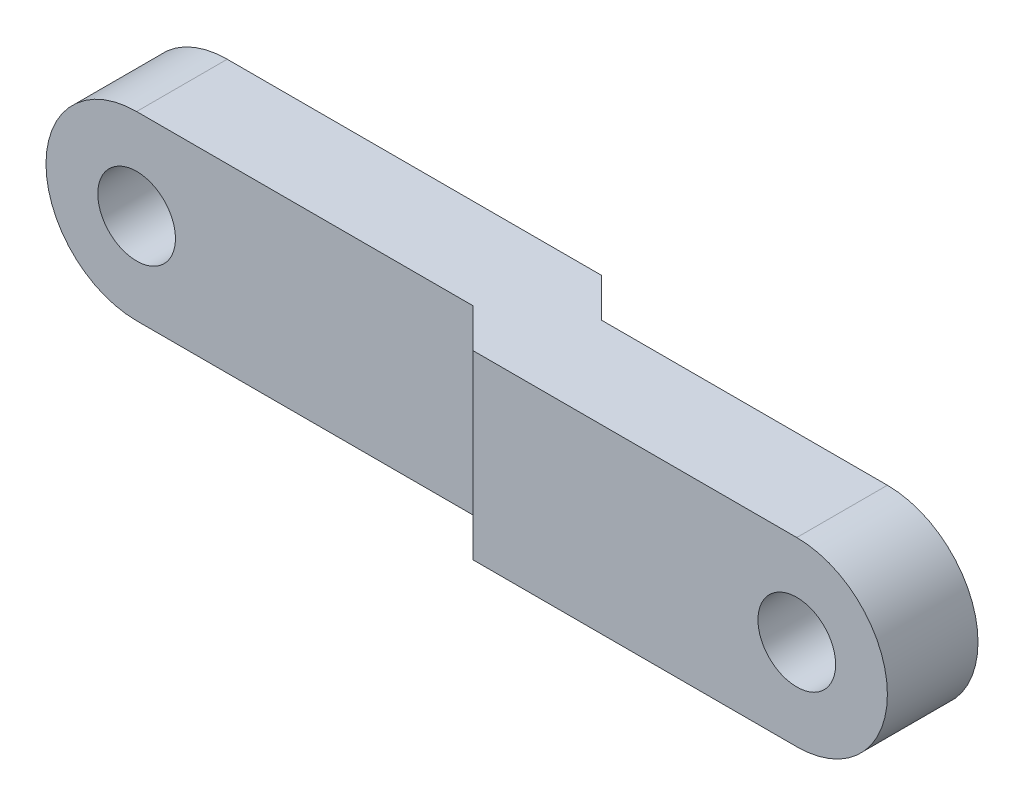
ISO-10303-21;
HEADER;
FILE_DESCRIPTION(('STEP AP214'),'2;1');
FILE_NAME('part.step','',(''),(''),'','','');
FILE_SCHEMA(('AUTOMOTIVE_DESIGN { 1 0 10303 214 1 1 1 1 }'));
ENDSEC;
DATA;
#1=APPLICATION_CONTEXT('core data for automotive mechanical design processes');
#2=APPLICATION_PROTOCOL_DEFINITION('international standard','automotive_design',2000,#1);
#3=PRODUCT_CONTEXT('',#1,'mechanical');
#4=PRODUCT('Part','Part','',(#3));
#5=PRODUCT_RELATED_PRODUCT_CATEGORY('part','',(#4));
#6=PRODUCT_DEFINITION_FORMATION('','',#4);
#7=PRODUCT_DEFINITION_CONTEXT('part definition',#1,'design');
#8=PRODUCT_DEFINITION('design','',#6,#7);
#9=PRODUCT_DEFINITION_SHAPE('','',#8);
#10=(LENGTH_UNIT() NAMED_UNIT(*) SI_UNIT(.MILLI.,.METRE.));
#11=(NAMED_UNIT(*) PLANE_ANGLE_UNIT() SI_UNIT($,.RADIAN.));
#12=(NAMED_UNIT(*) SI_UNIT($,.STERADIAN.) SOLID_ANGLE_UNIT());
#13=UNCERTAINTY_MEASURE_WITH_UNIT(LENGTH_MEASURE(1.E-05),#10,'distance_accuracy_value','');
#14=(GEOMETRIC_REPRESENTATION_CONTEXT(3) GLOBAL_UNCERTAINTY_ASSIGNED_CONTEXT((#13)) GLOBAL_UNIT_ASSIGNED_CONTEXT((#10,
#11,#12)) REPRESENTATION_CONTEXT('',''));
#15=CARTESIAN_POINT('',(0.,0.,0.));
#16=DIRECTION('',(0.,0.,1.));
#17=DIRECTION('',(1.,0.,0.));
#18=AXIS2_PLACEMENT_3D('',#15,#16,#17);
#19=CARTESIAN_POINT('',(0.,-3.5,5.));
#20=DIRECTION('',(0.,0.,-1.));
#21=DIRECTION('',(-1.,0.,0.));
#22=AXIS2_PLACEMENT_3D('',#19,#20,#21);
#23=PLANE('',#22);
#24=DIRECTION('',(-1.,0.,0.));
#25=VECTOR('',#24,1.);
#26=CARTESIAN_POINT('',(0.,0.,5.));
#27=LINE('',#26,#25);
#28=CARTESIAN_POINT('',(27.,0.,5.));
#29=VERTEX_POINT('',#28);
#30=CARTESIAN_POINT('',(14.5,0.,5.));
#31=VERTEX_POINT('',#30);
#32=EDGE_CURVE('E178',#29,#31,#27,.T.);
#33=ORIENTED_EDGE('',*,*,#32,.T.);
#34=DIRECTION('',(0.,1.,0.));
#35=VECTOR('',#34,1.);
#36=CARTESIAN_POINT('',(14.5,-7.,5.));
#37=LINE('',#36,#35);
#38=CARTESIAN_POINT('',(14.5,-7.,5.));
#39=VERTEX_POINT('',#38);
#40=EDGE_CURVE('E113',#39,#31,#37,.T.);
#41=ORIENTED_EDGE('',*,*,#40,.F.);
#42=DIRECTION('',(1.,0.,0.));
#43=VECTOR('',#42,1.);
#44=CARTESIAN_POINT('',(0.,-7.,5.));
#45=LINE('',#44,#43);
#46=CARTESIAN_POINT('',(27.,-7.,5.));
#47=VERTEX_POINT('',#46);
#48=EDGE_CURVE('E126',#39,#47,#45,.T.);
#49=ORIENTED_EDGE('',*,*,#48,.T.);
#50=CARTESIAN_POINT('',(27.,-3.5,5.));
#51=DIRECTION('',(0.,0.,1.));
#52=DIRECTION('',(-1.,0.,0.));
#53=AXIS2_PLACEMENT_3D('',#50,#51,#52);
#54=CIRCLE('',#53,3.5);
#55=EDGE_CURVE('E174',#47,#29,#54,.T.);
#56=ORIENTED_EDGE('',*,*,#55,.T.);
#57=EDGE_LOOP('',(#33,#41,#49,#56));
#58=FACE_BOUND('',#57,.T.);
#59=CARTESIAN_POINT('',(27.,-3.5,5.));
#60=DIRECTION('',(0.,0.,1.));
#61=DIRECTION('',(1.,0.,0.));
#62=AXIS2_PLACEMENT_3D('',#59,#60,#61);
#63=CIRCLE('',#62,1.5);
#64=CARTESIAN_POINT('',(28.5,-3.5,5.));
#65=VERTEX_POINT('',#64);
#66=EDGE_CURVE('E163',#65,#65,#63,.T.);
#67=ORIENTED_EDGE('',*,*,#66,.F.);
#68=EDGE_LOOP('',(#67));
#69=FACE_BOUND('',#68,.T.);
#70=ADVANCED_FACE('F39',(#58,#69),#23,.F.);
#71=CARTESIAN_POINT('',(0.,-3.5,0.));
#72=DIRECTION('',(0.,0.,-1.));
#73=DIRECTION('',(-1.,0.,0.));
#74=AXIS2_PLACEMENT_3D('',#71,#72,#73);
#75=PLANE('',#74);
#76=DIRECTION('',(0.,1.,0.));
#77=VECTOR('',#76,1.);
#78=CARTESIAN_POINT('',(14.4497474683058,-7.,0.));
#79=LINE('',#78,#77);
#80=CARTESIAN_POINT('',(14.4497474683058,-7.,0.));
#81=VERTEX_POINT('',#80);
#82=CARTESIAN_POINT('',(14.4497474683058,0.,0.));
#83=VERTEX_POINT('',#82);
#84=EDGE_CURVE('E134',#81,#83,#79,.T.);
#85=ORIENTED_EDGE('',*,*,#84,.F.);
#86=DIRECTION('',(1.,0.,0.));
#87=VECTOR('',#86,1.);
#88=CARTESIAN_POINT('',(0.,-7.,0.));
#89=LINE('',#88,#87);
#90=CARTESIAN_POINT('',(0.,-7.,0.));
#91=VERTEX_POINT('',#90);
#92=EDGE_CURVE('E186',#91,#81,#89,.T.);
#93=ORIENTED_EDGE('',*,*,#92,.F.);
#94=CARTESIAN_POINT('',(0.,-3.5,0.));
#95=DIRECTION('',(0.,0.,1.));
#96=DIRECTION('',(-1.,0.,0.));
#97=AXIS2_PLACEMENT_3D('',#94,#95,#96);
#98=CIRCLE('',#97,3.5);
#99=CARTESIAN_POINT('',(0.,0.,0.));
#100=VERTEX_POINT('',#99);
#101=EDGE_CURVE('E171',#100,#91,#98,.T.);
#102=ORIENTED_EDGE('',*,*,#101,.F.);
#103=DIRECTION('',(-1.,0.,0.));
#104=VECTOR('',#103,1.);
#105=CARTESIAN_POINT('',(0.,0.,0.));
#106=LINE('',#105,#104);
#107=EDGE_CURVE('E175',#83,#100,#106,.T.);
#108=ORIENTED_EDGE('',*,*,#107,.F.);
#109=EDGE_LOOP('',(#85,#93,#102,#108));
#110=FACE_BOUND('',#109,.T.);
#111=CARTESIAN_POINT('',(0.,-3.5,0.));
#112=DIRECTION('',(0.,0.,1.));
#113=DIRECTION('',(1.,0.,0.));
#114=AXIS2_PLACEMENT_3D('',#111,#112,#113);
#115=CIRCLE('',#114,1.5);
#116=CARTESIAN_POINT('',(1.5,-3.5,0.));
#117=VERTEX_POINT('',#116);
#118=EDGE_CURVE('E167',#117,#117,#115,.T.);
#119=ORIENTED_EDGE('',*,*,#118,.T.);
#120=EDGE_LOOP('',(#119));
#121=FACE_BOUND('',#120,.T.);
#122=ADVANCED_FACE('F216',(#110,#121),#75,.T.);
#123=CARTESIAN_POINT('',(0.,-3.5,5.));
#124=DIRECTION('',(0.,0.,-1.));
#125=DIRECTION('',(-1.,0.,0.));
#126=AXIS2_PLACEMENT_3D('',#123,#124,#125);
#127=CYLINDRICAL_SURFACE('',#126,3.5);
#128=CARTESIAN_POINT('',(0.,-3.5,3.5));
#129=DIRECTION('',(0.,0.,-1.));
#130=DIRECTION('',(-1.,0.,0.));
#131=AXIS2_PLACEMENT_3D('',#128,#129,#130);
#132=CIRCLE('',#131,3.5);
#133=CARTESIAN_POINT('',(0.,-7.,3.5));
#134=VERTEX_POINT('',#133);
#135=CARTESIAN_POINT('',(0.,0.,3.5));
#136=VERTEX_POINT('',#135);
#137=EDGE_CURVE('E118',#134,#136,#132,.T.);
#138=ORIENTED_EDGE('',*,*,#137,.T.);
#139=DIRECTION('',(0.,0.,-1.));
#140=VECTOR('',#139,1.);
#141=CARTESIAN_POINT('',(0.,0.,5.));
#142=LINE('',#141,#140);
#143=EDGE_CURVE('E182',#136,#100,#142,.T.);
#144=ORIENTED_EDGE('',*,*,#143,.T.);
#145=ORIENTED_EDGE('',*,*,#101,.T.);
#146=DIRECTION('',(0.,0.,-1.));
#147=VECTOR('',#146,1.);
#148=CARTESIAN_POINT('',(0.,-7.,5.));
#149=LINE('',#148,#147);
#150=EDGE_CURVE('E11',#134,#91,#149,.T.);
#151=ORIENTED_EDGE('',*,*,#150,.F.);
#152=EDGE_LOOP('',(#138,#144,#145,#151));
#153=FACE_BOUND('',#152,.T.);
#154=ADVANCED_FACE('F41',(#153),#127,.T.);
#155=CARTESIAN_POINT('',(0.,-7.,5.));
#156=DIRECTION('',(0.,1.,0.));
#157=DIRECTION('',(0.,0.,1.));
#158=AXIS2_PLACEMENT_3D('',#155,#156,#157);
#159=PLANE('',#158);
#160=ORIENTED_EDGE('',*,*,#48,.F.);
#161=DIRECTION('',(-0.707106781186546,0.,-0.707106781186549));
#162=VECTOR('',#161,1.);
#163=CARTESIAN_POINT('',(4.75000000000002,-7.,-4.75000000000001));
#164=LINE('',#163,#162);
#165=CARTESIAN_POINT('',(13.,-7.,3.5));
#166=VERTEX_POINT('',#165);
#167=EDGE_CURVE('E107',#39,#166,#164,.T.);
#168=ORIENTED_EDGE('',*,*,#167,.T.);
#169=DIRECTION('',(-1.,0.,0.));
#170=VECTOR('',#169,1.);
#171=CARTESIAN_POINT('',(0.,-7.,3.5));
#172=LINE('',#171,#170);
#173=EDGE_CURVE('E114',#166,#134,#172,.T.);
#174=ORIENTED_EDGE('',*,*,#173,.T.);
#175=ORIENTED_EDGE('',*,*,#150,.T.);
#176=ORIENTED_EDGE('',*,*,#92,.T.);
#177=DIRECTION('',(0.707106781186546,0.,0.707106781186549));
#178=VECTOR('',#177,1.);
#179=CARTESIAN_POINT('',(7.22487373415296,-7.,-7.22487373415292));
#180=LINE('',#179,#178);
#181=CARTESIAN_POINT('',(15.9497474683058,-7.,1.5));
#182=VERTEX_POINT('',#181);
#183=EDGE_CURVE('E139',#81,#182,#180,.T.);
#184=ORIENTED_EDGE('',*,*,#183,.T.);
#185=DIRECTION('',(1.,0.,0.));
#186=VECTOR('',#185,1.);
#187=CARTESIAN_POINT('',(0.,-7.,1.5));
#188=LINE('',#187,#186);
#189=CARTESIAN_POINT('',(27.,-7.,1.5));
#190=VERTEX_POINT('',#189);
#191=EDGE_CURVE('E143',#182,#190,#188,.T.);
#192=ORIENTED_EDGE('',*,*,#191,.T.);
#193=DIRECTION('',(0.,0.,-1.));
#194=VECTOR('',#193,1.);
#195=CARTESIAN_POINT('',(27.,-7.,5.));
#196=LINE('',#195,#194);
#197=EDGE_CURVE('E49',#47,#190,#196,.T.);
#198=ORIENTED_EDGE('',*,*,#197,.F.);
#199=EDGE_LOOP('',(#160,#168,#174,#175,#176,#184,#192,#198));
#200=FACE_BOUND('',#199,.T.);
#201=ADVANCED_FACE('F124',(#200),#159,.F.);
#202=CARTESIAN_POINT('',(27.,-3.5,5.));
#203=DIRECTION('',(0.,0.,-1.));
#204=DIRECTION('',(-1.,0.,0.));
#205=AXIS2_PLACEMENT_3D('',#202,#203,#204);
#206=CYLINDRICAL_SURFACE('',#205,3.5);
#207=CARTESIAN_POINT('',(27.,-3.5,1.5));
#208=DIRECTION('',(0.,0.,1.));
#209=DIRECTION('',(1.,0.,0.));
#210=AXIS2_PLACEMENT_3D('',#207,#208,#209);
#211=CIRCLE('',#210,3.5);
#212=CARTESIAN_POINT('',(27.,0.,1.5));
#213=VERTEX_POINT('',#212);
#214=EDGE_CURVE('E158',#190,#213,#211,.T.);
#215=ORIENTED_EDGE('',*,*,#214,.T.);
#216=DIRECTION('',(0.,0.,-1.));
#217=VECTOR('',#216,1.);
#218=CARTESIAN_POINT('',(27.,0.,5.));
#219=LINE('',#218,#217);
#220=EDGE_CURVE('E195',#29,#213,#219,.T.);
#221=ORIENTED_EDGE('',*,*,#220,.F.);
#222=ORIENTED_EDGE('',*,*,#55,.F.);
#223=ORIENTED_EDGE('',*,*,#197,.T.);
#224=EDGE_LOOP('',(#215,#221,#222,#223));
#225=FACE_BOUND('',#224,.T.);
#226=ADVANCED_FACE('F229',(#225),#206,.T.);
#227=CARTESIAN_POINT('',(0.,0.,5.));
#228=DIRECTION('',(0.,-1.,0.));
#229=DIRECTION('',(0.,0.,-1.));
#230=AXIS2_PLACEMENT_3D('',#227,#228,#229);
#231=PLANE('',#230);
#232=DIRECTION('',(-1.,0.,0.));
#233=VECTOR('',#232,1.);
#234=CARTESIAN_POINT('',(0.,0.,3.5));
#235=LINE('',#234,#233);
#236=CARTESIAN_POINT('',(13.,0.,3.5));
#237=VERTEX_POINT('',#236);
#238=EDGE_CURVE('E128',#237,#136,#235,.T.);
#239=ORIENTED_EDGE('',*,*,#238,.F.);
#240=DIRECTION('',(-0.707106781186546,0.,-0.707106781186549));
#241=VECTOR('',#240,1.);
#242=CARTESIAN_POINT('',(4.75000000000002,0.,-4.75000000000001));
#243=LINE('',#242,#241);
#244=EDGE_CURVE('E57',#31,#237,#243,.T.);
#245=ORIENTED_EDGE('',*,*,#244,.F.);
#246=ORIENTED_EDGE('',*,*,#32,.F.);
#247=ORIENTED_EDGE('',*,*,#220,.T.);
#248=DIRECTION('',(1.,0.,0.));
#249=VECTOR('',#248,1.);
#250=CARTESIAN_POINT('',(0.,0.,1.5));
#251=LINE('',#250,#249);
#252=CARTESIAN_POINT('',(15.9497474683058,0.,1.5));
#253=VERTEX_POINT('',#252);
#254=EDGE_CURVE('E144',#253,#213,#251,.T.);
#255=ORIENTED_EDGE('',*,*,#254,.F.);
#256=DIRECTION('',(0.707106781186546,0.,0.707106781186549));
#257=VECTOR('',#256,1.);
#258=CARTESIAN_POINT('',(7.22487373415296,0.,-7.22487373415292));
#259=LINE('',#258,#257);
#260=EDGE_CURVE('E65',#83,#253,#259,.T.);
#261=ORIENTED_EDGE('',*,*,#260,.F.);
#262=ORIENTED_EDGE('',*,*,#107,.T.);
#263=ORIENTED_EDGE('',*,*,#143,.F.);
#264=EDGE_LOOP('',(#239,#245,#246,#247,#255,#261,#262,#263));
#265=FACE_BOUND('',#264,.T.);
#266=ADVANCED_FACE('F226',(#265),#231,.F.);
#267=CARTESIAN_POINT('',(0.,-3.5,5.));
#268=DIRECTION('',(0.,0.,-1.));
#269=DIRECTION('',(-1.,0.,0.));
#270=AXIS2_PLACEMENT_3D('',#267,#268,#269);
#271=CYLINDRICAL_SURFACE('',#270,1.5);
#272=CARTESIAN_POINT('',(0.,-3.5,3.5));
#273=DIRECTION('',(0.,0.,-1.));
#274=DIRECTION('',(-1.,0.,0.));
#275=AXIS2_PLACEMENT_3D('',#272,#273,#274);
#276=CIRCLE('',#275,1.5);
#277=CARTESIAN_POINT('',(-1.5,-3.5,3.5));
#278=VERTEX_POINT('',#277);
#279=EDGE_CURVE('E43',#278,#278,#276,.T.);
#280=ORIENTED_EDGE('',*,*,#279,.F.);
#281=EDGE_LOOP('',(#280));
#282=FACE_BOUND('',#281,.T.);
#283=ORIENTED_EDGE('',*,*,#118,.F.);
#284=EDGE_LOOP('',(#283));
#285=FACE_BOUND('',#284,.T.);
#286=ADVANCED_FACE('F211',(#282,#285),#271,.F.);
#287=CARTESIAN_POINT('',(27.,-3.5,5.));
#288=DIRECTION('',(0.,0.,-1.));
#289=DIRECTION('',(-1.,0.,0.));
#290=AXIS2_PLACEMENT_3D('',#287,#288,#289);
#291=CYLINDRICAL_SURFACE('',#290,1.5);
#292=CARTESIAN_POINT('',(27.,-3.5,1.5));
#293=DIRECTION('',(0.,0.,1.));
#294=DIRECTION('',(1.,0.,0.));
#295=AXIS2_PLACEMENT_3D('',#292,#293,#294);
#296=CIRCLE('',#295,1.5);
#297=CARTESIAN_POINT('',(28.5,-3.5,1.5));
#298=VERTEX_POINT('',#297);
#299=EDGE_CURVE('E137',#298,#298,#296,.T.);
#300=ORIENTED_EDGE('',*,*,#299,.F.);
#301=EDGE_LOOP('',(#300));
#302=FACE_BOUND('',#301,.T.);
#303=ORIENTED_EDGE('',*,*,#66,.T.);
#304=EDGE_LOOP('',(#303));
#305=FACE_BOUND('',#304,.T.);
#306=ADVANCED_FACE('F208',(#302,#305),#291,.F.);
#307=CARTESIAN_POINT('',(0.,-7.,1.5));
#308=DIRECTION('',(0.,0.,1.));
#309=DIRECTION('',(1.,0.,0.));
#310=AXIS2_PLACEMENT_3D('',#307,#308,#309);
#311=PLANE('',#310);
#312=ORIENTED_EDGE('',*,*,#299,.T.);
#313=EDGE_LOOP('',(#312));
#314=FACE_BOUND('',#313,.T.);
#315=ORIENTED_EDGE('',*,*,#214,.F.);
#316=ORIENTED_EDGE('',*,*,#191,.F.);
#317=DIRECTION('',(0.,1.,0.));
#318=VECTOR('',#317,1.);
#319=CARTESIAN_POINT('',(15.9497474683058,-7.,1.5));
#320=LINE('',#319,#318);
#321=EDGE_CURVE('E148',#182,#253,#320,.T.);
#322=ORIENTED_EDGE('',*,*,#321,.T.);
#323=ORIENTED_EDGE('',*,*,#254,.T.);
#324=EDGE_LOOP('',(#315,#316,#322,#323));
#325=FACE_BOUND('',#324,.T.);
#326=ADVANCED_FACE('F205',(#314,#325),#311,.F.);
#327=CARTESIAN_POINT('',(7.22487373415296,-7.,-7.22487373415292));
#328=DIRECTION('',(-0.707106781186549,0.,0.707106781186546));
#329=DIRECTION('',(0.707106781186546,0.,0.707106781186549));
#330=AXIS2_PLACEMENT_3D('',#327,#328,#329);
#331=PLANE('',#330);
#332=ORIENTED_EDGE('',*,*,#260,.T.);
#333=ORIENTED_EDGE('',*,*,#321,.F.);
#334=ORIENTED_EDGE('',*,*,#183,.F.);
#335=ORIENTED_EDGE('',*,*,#84,.T.);
#336=EDGE_LOOP('',(#332,#333,#334,#335));
#337=FACE_BOUND('',#336,.T.);
#338=ADVANCED_FACE('F248',(#337),#331,.F.);
#339=CARTESIAN_POINT('',(0.,-7.,3.5));
#340=DIRECTION('',(0.,0.,-1.));
#341=DIRECTION('',(-1.,0.,0.));
#342=AXIS2_PLACEMENT_3D('',#339,#340,#341);
#343=PLANE('',#342);
#344=ORIENTED_EDGE('',*,*,#279,.T.);
#345=EDGE_LOOP('',(#344));
#346=FACE_BOUND('',#345,.T.);
#347=ORIENTED_EDGE('',*,*,#137,.F.);
#348=ORIENTED_EDGE('',*,*,#173,.F.);
#349=DIRECTION('',(0.,1.,0.));
#350=VECTOR('',#349,1.);
#351=CARTESIAN_POINT('',(13.,-7.,3.5));
#352=LINE('',#351,#350);
#353=EDGE_CURVE('E103',#166,#237,#352,.T.);
#354=ORIENTED_EDGE('',*,*,#353,.T.);
#355=ORIENTED_EDGE('',*,*,#238,.T.);
#356=EDGE_LOOP('',(#347,#348,#354,#355));
#357=FACE_BOUND('',#356,.T.);
#358=ADVANCED_FACE('F117',(#346,#357),#343,.F.);
#359=CARTESIAN_POINT('',(4.75000000000002,-7.,-4.75000000000001));
#360=DIRECTION('',(0.707106781186549,0.,-0.707106781186547));
#361=DIRECTION('',(-0.707106781186546,0.,-0.707106781186549));
#362=AXIS2_PLACEMENT_3D('',#359,#360,#361);
#363=PLANE('',#362);
#364=ORIENTED_EDGE('',*,*,#244,.T.);
#365=ORIENTED_EDGE('',*,*,#353,.F.);
#366=ORIENTED_EDGE('',*,*,#167,.F.);
#367=ORIENTED_EDGE('',*,*,#40,.T.);
#368=EDGE_LOOP('',(#364,#365,#366,#367));
#369=FACE_BOUND('',#368,.T.);
#370=ADVANCED_FACE('F105',(#369),#363,.F.);
#371=CLOSED_SHELL('',(#70,#122,#154,#201,#226,#266,#286,#306,#326,#338,#358,#370));
#372=MANIFOLD_SOLID_BREP('B2',#371);
#373=ADVANCED_BREP_SHAPE_REPRESENTATION('',(#18,#372),#14);
#374=SHAPE_DEFINITION_REPRESENTATION(#9,#373);
ENDSEC;
END-ISO-10303-21;
